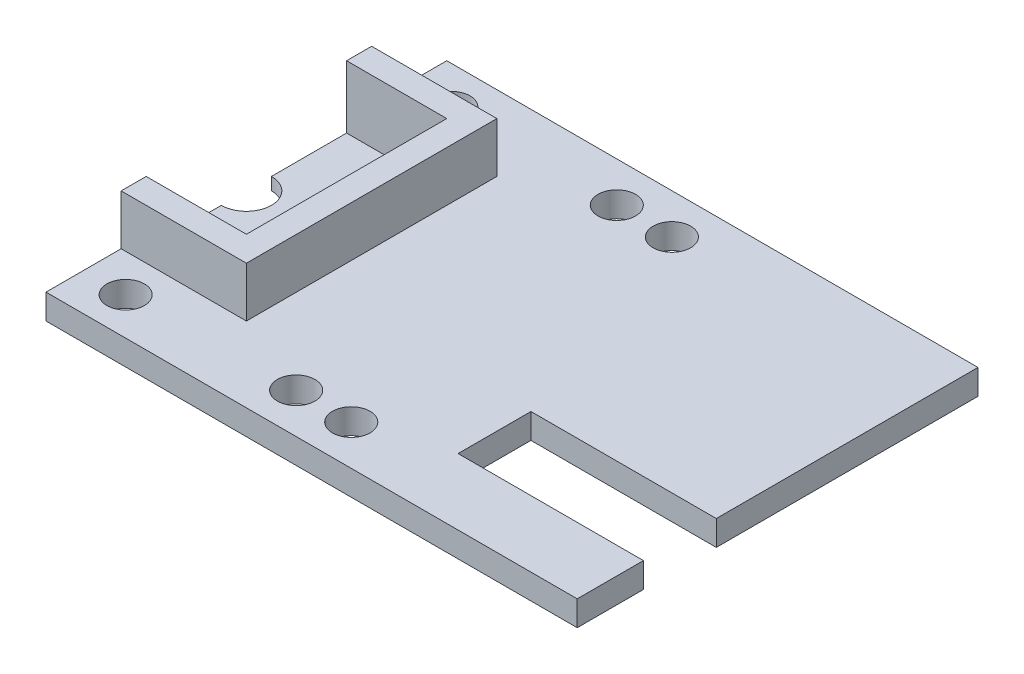
ISO-10303-21;
HEADER;
FILE_DESCRIPTION(('STEP AP214'),'2;1');
FILE_NAME('part.step','',(''),(''),'','','');
FILE_SCHEMA(('AUTOMOTIVE_DESIGN { 1 0 10303 214 1 1 1 1 }'));
ENDSEC;
DATA;
#1=APPLICATION_CONTEXT('core data for automotive mechanical design processes');
#2=APPLICATION_PROTOCOL_DEFINITION('international standard','automotive_design',2000,#1);
#3=PRODUCT_CONTEXT('',#1,'mechanical');
#4=PRODUCT('Part','Part','',(#3));
#5=PRODUCT_RELATED_PRODUCT_CATEGORY('part','',(#4));
#6=PRODUCT_DEFINITION_FORMATION('','',#4);
#7=PRODUCT_DEFINITION_CONTEXT('part definition',#1,'design');
#8=PRODUCT_DEFINITION('design','',#6,#7);
#9=PRODUCT_DEFINITION_SHAPE('','',#8);
#10=(LENGTH_UNIT() NAMED_UNIT(*) SI_UNIT(.MILLI.,.METRE.));
#11=(NAMED_UNIT(*) PLANE_ANGLE_UNIT() SI_UNIT($,.RADIAN.));
#12=(NAMED_UNIT(*) SI_UNIT($,.STERADIAN.) SOLID_ANGLE_UNIT());
#13=UNCERTAINTY_MEASURE_WITH_UNIT(LENGTH_MEASURE(1.E-05),#10,'distance_accuracy_value','');
#14=(GEOMETRIC_REPRESENTATION_CONTEXT(3) GLOBAL_UNCERTAINTY_ASSIGNED_CONTEXT((#13)) GLOBAL_UNIT_ASSIGNED_CONTEXT((#10,
#11,#12)) REPRESENTATION_CONTEXT('',''));
#15=CARTESIAN_POINT('',(0.,0.,0.));
#16=DIRECTION('',(0.,0.,1.));
#17=DIRECTION('',(1.,0.,0.));
#18=AXIS2_PLACEMENT_3D('',#15,#16,#17);
#19=CARTESIAN_POINT('',(-134.66620377136,386.673855357242,0.));
#20=DIRECTION('',(1.,0.,0.));
#21=DIRECTION('',(0.,0.,-1.));
#22=AXIS2_PLACEMENT_3D('',#19,#20,#21);
#23=PLANE('',#22);
#24=DIRECTION('',(0.,-1.,0.));
#25=VECTOR('',#24,1.);
#26=CARTESIAN_POINT('',(-134.66620377136,386.673855357242,-50.8));
#27=LINE('',#26,#25);
#28=CARTESIAN_POINT('',(-134.66620377136,6.35000000000013,-50.8));
#29=VERTEX_POINT('',#28);
#30=CARTESIAN_POINT('',(-134.66620377136,1.11022302462516E-13,-50.8));
#31=VERTEX_POINT('',#30);
#32=EDGE_CURVE('E171',#29,#31,#27,.T.);
#33=ORIENTED_EDGE('',*,*,#32,.T.);
#34=DIRECTION('',(0.,0.,1.));
#35=VECTOR('',#34,1.);
#36=CARTESIAN_POINT('',(-134.66620377136,0.,0.));
#37=LINE('',#36,#35);
#38=CARTESIAN_POINT('',(-134.66620377136,0.,-6.34999999999999));
#39=VERTEX_POINT('',#38);
#40=EDGE_CURVE('E290',#31,#39,#37,.T.);
#41=ORIENTED_EDGE('',*,*,#40,.T.);
#42=DIRECTION('',(0.,1.,0.));
#43=VECTOR('',#42,1.);
#44=CARTESIAN_POINT('',(-134.66620377136,0.,-6.34999999999999));
#45=LINE('',#44,#43);
#46=CARTESIAN_POINT('',(-134.66620377136,3.175,-6.35));
#47=VERTEX_POINT('',#46);
#48=EDGE_CURVE('E293',#47,#39,#45,.F.);
#49=ORIENTED_EDGE('',*,*,#48,.F.);
#50=DIRECTION('',(0.,0.,-1.));
#51=VECTOR('',#50,1.);
#52=CARTESIAN_POINT('',(-134.66620377136,3.175,0.));
#53=LINE('',#52,#51);
#54=CARTESIAN_POINT('',(-134.66620377136,3.175,-25.4));
#55=VERTEX_POINT('',#54);
#56=EDGE_CURVE('E54',#47,#55,#53,.T.);
#57=ORIENTED_EDGE('',*,*,#56,.T.);
#58=DIRECTION('',(0.,-1.,0.));
#59=VECTOR('',#58,1.);
#60=CARTESIAN_POINT('',(-134.66620377136,3.175,-25.4));
#61=LINE('',#60,#59);
#62=CARTESIAN_POINT('',(-134.66620377136,19.05,-25.4));
#63=VERTEX_POINT('',#62);
#64=EDGE_CURVE('E11',#63,#55,#61,.T.);
#65=ORIENTED_EDGE('',*,*,#64,.F.);
#66=DIRECTION('',(0.,0.,-1.));
#67=VECTOR('',#66,1.);
#68=CARTESIAN_POINT('',(-134.66620377136,19.05,0.));
#69=LINE('',#68,#67);
#70=CARTESIAN_POINT('',(-134.66620377136,19.05,-31.75));
#71=VERTEX_POINT('',#70);
#72=EDGE_CURVE('E351',#63,#71,#69,.T.);
#73=ORIENTED_EDGE('',*,*,#72,.T.);
#74=DIRECTION('',(0.,1.,0.));
#75=VECTOR('',#74,1.);
#76=CARTESIAN_POINT('',(-134.66620377136,19.05,-31.75));
#77=LINE('',#76,#75);
#78=CARTESIAN_POINT('',(-134.66620377136,6.35,-31.75));
#79=VERTEX_POINT('',#78);
#80=EDGE_CURVE('E354',#79,#71,#77,.T.);
#81=ORIENTED_EDGE('',*,*,#80,.F.);
#82=DIRECTION('',(0.,0.,1.));
#83=VECTOR('',#82,1.);
#84=CARTESIAN_POINT('',(-134.66620377136,6.35,0.));
#85=LINE('',#84,#83);
#86=EDGE_CURVE('E297',#29,#79,#85,.T.);
#87=ORIENTED_EDGE('',*,*,#86,.F.);
#88=EDGE_LOOP('',(#33,#41,#49,#57,#65,#73,#81,#87));
#89=FACE_BOUND('',#88,.T.);
#90=ADVANCED_FACE('F39',(#89),#23,.F.);
#91=CARTESIAN_POINT('',(0.,6.35,50.8));
#92=DIRECTION('',(-1.,0.,0.));
#93=DIRECTION('',(0.,0.,1.));
#94=AXIS2_PLACEMENT_3D('',#91,#92,#93);
#95=PLANE('',#94);
#96=DIRECTION('',(0.,0.,-1.));
#97=VECTOR('',#96,1.);
#98=CARTESIAN_POINT('',(0.,0.,50.8));
#99=LINE('',#98,#97);
#100=CARTESIAN_POINT('',(0.,0.,50.8));
#101=VERTEX_POINT('',#100);
#102=CARTESIAN_POINT('',(0.,0.,34.0128352));
#103=VERTEX_POINT('',#102);
#104=EDGE_CURVE('E198',#101,#103,#99,.T.);
#105=ORIENTED_EDGE('',*,*,#104,.T.);
#106=DIRECTION('',(0.,1.,0.));
#107=VECTOR('',#106,1.);
#108=CARTESIAN_POINT('',(0.,0.,34.0128352));
#109=LINE('',#108,#107);
#110=CARTESIAN_POINT('',(0.,6.35,34.0128352));
#111=VERTEX_POINT('',#110);
#112=EDGE_CURVE('E313',#103,#111,#109,.T.);
#113=ORIENTED_EDGE('',*,*,#112,.T.);
#114=DIRECTION('',(0.,0.,-1.));
#115=VECTOR('',#114,1.);
#116=CARTESIAN_POINT('',(0.,6.35,50.8));
#117=LINE('',#116,#115);
#118=CARTESIAN_POINT('',(0.,6.35,50.8));
#119=VERTEX_POINT('',#118);
#120=EDGE_CURVE('E194',#119,#111,#117,.T.);
#121=ORIENTED_EDGE('',*,*,#120,.F.);
#122=DIRECTION('',(0.,-1.,0.));
#123=VECTOR('',#122,1.);
#124=CARTESIAN_POINT('',(0.,6.35,50.8));
#125=LINE('',#124,#123);
#126=EDGE_CURVE('E188',#119,#101,#125,.T.);
#127=ORIENTED_EDGE('',*,*,#126,.T.);
#128=EDGE_LOOP('',(#105,#113,#121,#127));
#129=FACE_BOUND('',#128,.T.);
#130=ADVANCED_FACE('F434',(#129),#95,.F.);
#131=CARTESIAN_POINT('',(-134.66620377136,0.,0.));
#132=DIRECTION('',(0.,1.,0.));
#133=DIRECTION('',(0.,0.,1.));
#134=AXIS2_PLACEMENT_3D('',#131,#132,#133);
#135=CYLINDRICAL_SURFACE('',#134,6.35);
#136=CARTESIAN_POINT('',(-134.66620377136,3.175,0.));
#137=DIRECTION('',(0.,1.,0.));
#138=DIRECTION('',(0.,0.,1.));
#139=AXIS2_PLACEMENT_3D('',#136,#137,#138);
#140=CIRCLE('',#139,6.35);
#141=CARTESIAN_POINT('',(-134.66620377136,3.175,6.35));
#142=VERTEX_POINT('',#141);
#143=EDGE_CURVE('E210',#47,#142,#140,.F.);
#144=ORIENTED_EDGE('',*,*,#143,.F.);
#145=ORIENTED_EDGE('',*,*,#48,.T.);
#146=CARTESIAN_POINT('',(-134.66620377136,0.,0.));
#147=DIRECTION('',(0.,1.,0.));
#148=DIRECTION('',(0.,0.,1.));
#149=AXIS2_PLACEMENT_3D('',#146,#147,#148);
#150=CIRCLE('',#149,6.35);
#151=CARTESIAN_POINT('',(-134.66620377136,0.,6.34999999999999));
#152=VERTEX_POINT('',#151);
#153=EDGE_CURVE('E266',#152,#39,#150,.T.);
#154=ORIENTED_EDGE('',*,*,#153,.F.);
#155=DIRECTION('',(0.,1.,0.));
#156=VECTOR('',#155,1.);
#157=CARTESIAN_POINT('',(-134.66620377136,0.,6.34999999999999));
#158=LINE('',#157,#156);
#159=EDGE_CURVE('E183',#152,#142,#158,.T.);
#160=ORIENTED_EDGE('',*,*,#159,.T.);
#161=EDGE_LOOP('',(#144,#145,#154,#160));
#162=FACE_BOUND('',#161,.T.);
#163=ADVANCED_FACE('F375',(#162),#135,.F.);
#164=CARTESIAN_POINT('',(0.,6.35,0.));
#165=DIRECTION('',(0.,-1.,0.));
#166=DIRECTION('',(0.,0.,-1.));
#167=AXIS2_PLACEMENT_3D('',#164,#165,#166);
#168=PLANE('',#167);
#169=CARTESIAN_POINT('',(-123.99820377136,6.35,41.275));
#170=DIRECTION('',(0.,-1.,0.));
#171=DIRECTION('',(0.,0.,-1.));
#172=AXIS2_PLACEMENT_3D('',#169,#170,#171);
#173=CIRCLE('',#172,4.7625);
#174=CARTESIAN_POINT('',(-123.99820377136,6.35,36.5125));
#175=VERTEX_POINT('',#174);
#176=EDGE_CURVE('E384',#175,#175,#173,.T.);
#177=ORIENTED_EDGE('',*,*,#176,.T.);
#178=EDGE_LOOP('',(#177));
#179=FACE_BOUND('',#178,.T.);
#180=CARTESIAN_POINT('',(-123.99820377136,6.35,-41.275));
#181=DIRECTION('',(0.,1.,0.));
#182=DIRECTION('',(0.,0.,1.));
#183=AXIS2_PLACEMENT_3D('',#180,#181,#182);
#184=CIRCLE('',#183,4.7625);
#185=CARTESIAN_POINT('',(-123.99820377136,6.35,-36.5125));
#186=VERTEX_POINT('',#185);
#187=EDGE_CURVE('E378',#186,#186,#184,.T.);
#188=ORIENTED_EDGE('',*,*,#187,.F.);
#189=EDGE_LOOP('',(#188));
#190=FACE_BOUND('',#189,.T.);
#191=CARTESIAN_POINT('',(-81.4119589800342,6.35,40.64));
#192=DIRECTION('',(0.,1.,0.));
#193=DIRECTION('',(0.,0.,1.));
#194=AXIS2_PLACEMENT_3D('',#191,#192,#193);
#195=CIRCLE('',#194,4.7625);
#196=CARTESIAN_POINT('',(-81.4119589800342,6.35,45.4025));
#197=VERTEX_POINT('',#196);
#198=EDGE_CURVE('E331',#197,#197,#195,.T.);
#199=ORIENTED_EDGE('',*,*,#198,.F.);
#200=EDGE_LOOP('',(#199));
#201=FACE_BOUND('',#200,.T.);
#202=CARTESIAN_POINT('',(-67.4419589800342,6.35,-40.64));
#203=DIRECTION('',(0.,1.,0.));
#204=DIRECTION('',(0.,0.,1.));
#205=AXIS2_PLACEMENT_3D('',#202,#203,#204);
#206=CIRCLE('',#205,4.7625);
#207=CARTESIAN_POINT('',(-67.4419589800342,6.35,-35.8775));
#208=VERTEX_POINT('',#207);
#209=EDGE_CURVE('E325',#208,#208,#206,.T.);
#210=ORIENTED_EDGE('',*,*,#209,.F.);
#211=EDGE_LOOP('',(#210));
#212=FACE_BOUND('',#211,.T.);
#213=CARTESIAN_POINT('',(-81.4119589800342,6.35,-40.64));
#214=DIRECTION('',(0.,1.,0.));
#215=DIRECTION('',(0.,0.,1.));
#216=AXIS2_PLACEMENT_3D('',#213,#214,#215);
#217=CIRCLE('',#216,4.7625);
#218=CARTESIAN_POINT('',(-81.4119589800342,6.35,-35.8775));
#219=VERTEX_POINT('',#218);
#220=EDGE_CURVE('E316',#219,#219,#217,.T.);
#221=ORIENTED_EDGE('',*,*,#220,.F.);
#222=EDGE_LOOP('',(#221));
#223=FACE_BOUND('',#222,.T.);
#224=CARTESIAN_POINT('',(-67.4419589800342,6.35,40.64));
#225=DIRECTION('',(0.,1.,0.));
#226=DIRECTION('',(0.,0.,1.));
#227=AXIS2_PLACEMENT_3D('',#224,#225,#226);
#228=CIRCLE('',#227,4.7625);
#229=CARTESIAN_POINT('',(-67.4419589800342,6.35,45.4025));
#230=VERTEX_POINT('',#229);
#231=EDGE_CURVE('E235',#230,#230,#228,.T.);
#232=ORIENTED_EDGE('',*,*,#231,.F.);
#233=EDGE_LOOP('',(#232));
#234=FACE_BOUND('',#233,.T.);
#235=DIRECTION('',(-1.,0.,0.));
#236=VECTOR('',#235,1.);
#237=CARTESIAN_POINT('',(-279.4,6.35,-50.8));
#238=LINE('',#237,#236);
#239=CARTESIAN_POINT('',(0.,6.35,-50.8));
#240=VERTEX_POINT('',#239);
#241=EDGE_CURVE('E190',#240,#29,#238,.T.);
#242=ORIENTED_EDGE('',*,*,#241,.T.);
#243=ORIENTED_EDGE('',*,*,#86,.T.);
#244=DIRECTION('',(-1.,0.,0.));
#245=VECTOR('',#244,1.);
#246=CARTESIAN_POINT('',(-102.91620377136,6.35,-31.75));
#247=LINE('',#246,#245);
#248=CARTESIAN_POINT('',(-102.91620377136,6.35,-31.75));
#249=VERTEX_POINT('',#248);
#250=EDGE_CURVE('E249',#249,#79,#247,.T.);
#251=ORIENTED_EDGE('',*,*,#250,.F.);
#252=DIRECTION('',(0.,0.,-1.));
#253=VECTOR('',#252,1.);
#254=CARTESIAN_POINT('',(-102.91620377136,6.35,31.75));
#255=LINE('',#254,#253);
#256=CARTESIAN_POINT('',(-102.91620377136,6.35,31.75));
#257=VERTEX_POINT('',#256);
#258=EDGE_CURVE('E256',#257,#249,#255,.T.);
#259=ORIENTED_EDGE('',*,*,#258,.F.);
#260=DIRECTION('',(1.,0.,0.));
#261=VECTOR('',#260,1.);
#262=CARTESIAN_POINT('',(-102.91620377136,6.35,31.75));
#263=LINE('',#262,#261);
#264=CARTESIAN_POINT('',(-134.66620377136,6.35,31.75));
#265=VERTEX_POINT('',#264);
#266=EDGE_CURVE('E182',#265,#257,#263,.T.);
#267=ORIENTED_EDGE('',*,*,#266,.F.);
#268=DIRECTION('',(0.,0.,1.));
#269=VECTOR('',#268,1.);
#270=CARTESIAN_POINT('',(-134.66620377136,6.35,0.));
#271=LINE('',#270,#269);
#272=CARTESIAN_POINT('',(-134.66620377136,6.35000000000013,50.8));
#273=VERTEX_POINT('',#272);
#274=EDGE_CURVE('E164',#265,#273,#271,.T.);
#275=ORIENTED_EDGE('',*,*,#274,.T.);
#276=DIRECTION('',(1.,0.,0.));
#277=VECTOR('',#276,1.);
#278=CARTESIAN_POINT('',(-279.4,6.35,50.8));
#279=LINE('',#278,#277);
#280=EDGE_CURVE('E179',#273,#119,#279,.T.);
#281=ORIENTED_EDGE('',*,*,#280,.T.);
#282=ORIENTED_EDGE('',*,*,#120,.T.);
#283=DIRECTION('',(1.,0.,0.));
#284=VECTOR('',#283,1.);
#285=CARTESIAN_POINT('',(0.,6.35,34.0128352));
#286=LINE('',#285,#284);
#287=CARTESIAN_POINT('',(-46.9900000000001,6.35,34.0128352));
#288=VERTEX_POINT('',#287);
#289=EDGE_CURVE('E304',#288,#111,#286,.T.);
#290=ORIENTED_EDGE('',*,*,#289,.F.);
#291=DIRECTION('',(0.,0.,1.));
#292=VECTOR('',#291,1.);
#293=CARTESIAN_POINT('',(-46.9900000000001,6.35,34.0128352));
#294=LINE('',#293,#292);
#295=CARTESIAN_POINT('',(-46.9900000000001,6.35,15.542584104));
#296=VERTEX_POINT('',#295);
#297=EDGE_CURVE('E295',#296,#288,#294,.T.);
#298=ORIENTED_EDGE('',*,*,#297,.F.);
#299=DIRECTION('',(-1.,0.,0.));
#300=VECTOR('',#299,1.);
#301=CARTESIAN_POINT('',(0.,6.35,15.542584104));
#302=LINE('',#301,#300);
#303=CARTESIAN_POINT('',(0.,6.35,15.542584104));
#304=VERTEX_POINT('',#303);
#305=EDGE_CURVE('E275',#304,#296,#302,.T.);
#306=ORIENTED_EDGE('',*,*,#305,.F.);
#307=EDGE_CURVE('E206',#304,#240,#117,.T.);
#308=ORIENTED_EDGE('',*,*,#307,.T.);
#309=EDGE_LOOP('',(#242,#243,#251,#259,#267,#275,#281,#282,#290,#298,#306,#308));
#310=FACE_BOUND('',#309,.T.);
#311=ADVANCED_FACE('F177',(#179,#190,#201,#212,#223,#234,#310),#168,.F.);
#312=ORIENTED_EDGE('',*,*,#307,.F.);
#313=DIRECTION('',(0.,1.,0.));
#314=VECTOR('',#313,1.);
#315=CARTESIAN_POINT('',(0.,0.,15.542584104));
#316=LINE('',#315,#314);
#317=CARTESIAN_POINT('',(0.,0.,15.542584104));
#318=VERTEX_POINT('',#317);
#319=EDGE_CURVE('E284',#318,#304,#316,.T.);
#320=ORIENTED_EDGE('',*,*,#319,.F.);
#321=CARTESIAN_POINT('',(0.,0.,-50.8));
#322=VERTEX_POINT('',#321);
#323=EDGE_CURVE('E202',#318,#322,#99,.T.);
#324=ORIENTED_EDGE('',*,*,#323,.T.);
#325=DIRECTION('',(0.,-1.,0.));
#326=VECTOR('',#325,1.);
#327=CARTESIAN_POINT('',(0.,6.35,-50.8));
#328=LINE('',#327,#326);
#329=EDGE_CURVE('E192',#240,#322,#328,.T.);
#330=ORIENTED_EDGE('',*,*,#329,.F.);
#331=EDGE_LOOP('',(#312,#320,#324,#330));
#332=FACE_BOUND('',#331,.T.);
#333=ADVANCED_FACE('F41',(#332),#95,.F.);
#334=CARTESIAN_POINT('',(-279.4,6.35,-50.8));
#335=DIRECTION('',(0.,0.,1.));
#336=DIRECTION('',(1.,0.,0.));
#337=AXIS2_PLACEMENT_3D('',#334,#335,#336);
#338=PLANE('',#337);
#339=DIRECTION('',(-1.,0.,0.));
#340=VECTOR('',#339,1.);
#341=CARTESIAN_POINT('',(-279.4,0.,-50.8));
#342=LINE('',#341,#340);
#343=EDGE_CURVE('E201',#322,#31,#342,.T.);
#344=ORIENTED_EDGE('',*,*,#343,.T.);
#345=ORIENTED_EDGE('',*,*,#32,.F.);
#346=ORIENTED_EDGE('',*,*,#241,.F.);
#347=ORIENTED_EDGE('',*,*,#329,.T.);
#348=EDGE_LOOP('',(#344,#345,#346,#347));
#349=FACE_BOUND('',#348,.T.);
#350=ADVANCED_FACE('F281',(#349),#338,.F.);
#351=CARTESIAN_POINT('',(-279.4,6.35,50.8));
#352=DIRECTION('',(0.,0.,-1.));
#353=DIRECTION('',(-1.,0.,0.));
#354=AXIS2_PLACEMENT_3D('',#351,#352,#353);
#355=PLANE('',#354);
#356=ORIENTED_EDGE('',*,*,#280,.F.);
#357=DIRECTION('',(0.,-1.,0.));
#358=VECTOR('',#357,1.);
#359=CARTESIAN_POINT('',(-134.66620377136,386.673855357242,50.8));
#360=LINE('',#359,#358);
#361=CARTESIAN_POINT('',(-134.66620377136,1.11022302462516E-13,50.8));
#362=VERTEX_POINT('',#361);
#363=EDGE_CURVE('E161',#273,#362,#360,.T.);
#364=ORIENTED_EDGE('',*,*,#363,.T.);
#365=DIRECTION('',(1.,0.,0.));
#366=VECTOR('',#365,1.);
#367=CARTESIAN_POINT('',(-279.4,0.,50.8));
#368=LINE('',#367,#366);
#369=EDGE_CURVE('E205',#362,#101,#368,.T.);
#370=ORIENTED_EDGE('',*,*,#369,.T.);
#371=ORIENTED_EDGE('',*,*,#126,.F.);
#372=EDGE_LOOP('',(#356,#364,#370,#371));
#373=FACE_BOUND('',#372,.T.);
#374=ADVANCED_FACE('F186',(#373),#355,.F.);
#375=CARTESIAN_POINT('',(0.,0.,0.));
#376=DIRECTION('',(0.,-1.,0.));
#377=DIRECTION('',(0.,0.,-1.));
#378=AXIS2_PLACEMENT_3D('',#375,#376,#377);
#379=PLANE('',#378);
#380=CARTESIAN_POINT('',(-123.99820377136,0.,41.275));
#381=DIRECTION('',(0.,-1.,0.));
#382=DIRECTION('',(0.,0.,-1.));
#383=AXIS2_PLACEMENT_3D('',#380,#381,#382);
#384=CIRCLE('',#383,4.7625);
#385=CARTESIAN_POINT('',(-123.99820377136,0.,36.5125));
#386=VERTEX_POINT('',#385);
#387=EDGE_CURVE('E381',#386,#386,#384,.T.);
#388=ORIENTED_EDGE('',*,*,#387,.F.);
#389=EDGE_LOOP('',(#388));
#390=FACE_BOUND('',#389,.T.);
#391=CARTESIAN_POINT('',(-123.99820377136,0.,-41.275));
#392=DIRECTION('',(0.,1.,0.));
#393=DIRECTION('',(0.,0.,1.));
#394=AXIS2_PLACEMENT_3D('',#391,#392,#393);
#395=CIRCLE('',#394,4.7625);
#396=CARTESIAN_POINT('',(-123.99820377136,0.,-36.5125));
#397=VERTEX_POINT('',#396);
#398=EDGE_CURVE('E172',#397,#397,#395,.T.);
#399=ORIENTED_EDGE('',*,*,#398,.T.);
#400=EDGE_LOOP('',(#399));
#401=FACE_BOUND('',#400,.T.);
#402=ORIENTED_EDGE('',*,*,#40,.F.);
#403=ORIENTED_EDGE('',*,*,#343,.F.);
#404=ORIENTED_EDGE('',*,*,#323,.F.);
#405=DIRECTION('',(-1.,0.,0.));
#406=VECTOR('',#405,1.);
#407=CARTESIAN_POINT('',(0.,0.,15.542584104));
#408=LINE('',#407,#406);
#409=CARTESIAN_POINT('',(-46.9900000000001,0.,15.542584104));
#410=VERTEX_POINT('',#409);
#411=EDGE_CURVE('E301',#318,#410,#408,.T.);
#412=ORIENTED_EDGE('',*,*,#411,.T.);
#413=DIRECTION('',(0.,0.,1.));
#414=VECTOR('',#413,1.);
#415=CARTESIAN_POINT('',(-46.9900000000001,0.,34.0128352));
#416=LINE('',#415,#414);
#417=CARTESIAN_POINT('',(-46.9900000000001,0.,34.0128352));
#418=VERTEX_POINT('',#417);
#419=EDGE_CURVE('E303',#410,#418,#416,.T.);
#420=ORIENTED_EDGE('',*,*,#419,.T.);
#421=DIRECTION('',(1.,0.,0.));
#422=VECTOR('',#421,1.);
#423=CARTESIAN_POINT('',(0.,0.,34.0128352));
#424=LINE('',#423,#422);
#425=EDGE_CURVE('E307',#418,#103,#424,.T.);
#426=ORIENTED_EDGE('',*,*,#425,.T.);
#427=ORIENTED_EDGE('',*,*,#104,.F.);
#428=ORIENTED_EDGE('',*,*,#369,.F.);
#429=DIRECTION('',(0.,0.,1.));
#430=VECTOR('',#429,1.);
#431=CARTESIAN_POINT('',(-134.66620377136,0.,0.));
#432=LINE('',#431,#430);
#433=EDGE_CURVE('E167',#152,#362,#432,.T.);
#434=ORIENTED_EDGE('',*,*,#433,.F.);
#435=ORIENTED_EDGE('',*,*,#153,.T.);
#436=EDGE_LOOP('',(#402,#403,#404,#412,#420,#426,#427,#428,#434,#435));
#437=FACE_BOUND('',#436,.T.);
#438=CARTESIAN_POINT('',(-81.4119589800342,0.,40.64));
#439=DIRECTION('',(0.,1.,0.));
#440=DIRECTION('',(0.,0.,1.));
#441=AXIS2_PLACEMENT_3D('',#438,#439,#440);
#442=CIRCLE('',#441,4.7625);
#443=CARTESIAN_POINT('',(-81.4119589800342,0.,45.4025));
#444=VERTEX_POINT('',#443);
#445=EDGE_CURVE('E328',#444,#444,#442,.T.);
#446=ORIENTED_EDGE('',*,*,#445,.T.);
#447=EDGE_LOOP('',(#446));
#448=FACE_BOUND('',#447,.T.);
#449=CARTESIAN_POINT('',(-67.4419589800342,0.,-40.64));
#450=DIRECTION('',(0.,1.,0.));
#451=DIRECTION('',(0.,0.,1.));
#452=AXIS2_PLACEMENT_3D('',#449,#450,#451);
#453=CIRCLE('',#452,4.7625);
#454=CARTESIAN_POINT('',(-67.4419589800342,0.,-35.8775));
#455=VERTEX_POINT('',#454);
#456=EDGE_CURVE('E334',#455,#455,#453,.T.);
#457=ORIENTED_EDGE('',*,*,#456,.T.);
#458=EDGE_LOOP('',(#457));
#459=FACE_BOUND('',#458,.T.);
#460=CARTESIAN_POINT('',(-81.4119589800342,0.,-40.64));
#461=DIRECTION('',(0.,1.,0.));
#462=DIRECTION('',(0.,0.,1.));
#463=AXIS2_PLACEMENT_3D('',#460,#461,#462);
#464=CIRCLE('',#463,4.7625);
#465=CARTESIAN_POINT('',(-81.4119589800342,0.,-35.8775));
#466=VERTEX_POINT('',#465);
#467=EDGE_CURVE('E322',#466,#466,#464,.T.);
#468=ORIENTED_EDGE('',*,*,#467,.T.);
#469=EDGE_LOOP('',(#468));
#470=FACE_BOUND('',#469,.T.);
#471=CARTESIAN_POINT('',(-67.4419589800342,0.,40.64));
#472=DIRECTION('',(0.,1.,0.));
#473=DIRECTION('',(0.,0.,1.));
#474=AXIS2_PLACEMENT_3D('',#471,#472,#473);
#475=CIRCLE('',#474,4.7625);
#476=CARTESIAN_POINT('',(-67.4419589800342,0.,45.4025));
#477=VERTEX_POINT('',#476);
#478=EDGE_CURVE('E230',#477,#477,#475,.T.);
#479=ORIENTED_EDGE('',*,*,#478,.T.);
#480=EDGE_LOOP('',(#479));
#481=FACE_BOUND('',#480,.T.);
#482=ADVANCED_FACE('F288',(#390,#401,#437,#448,#459,#470,#481),#379,.T.);
#483=CARTESIAN_POINT('',(-102.91620377136,19.05,31.75));
#484=DIRECTION('',(0.,0.,-1.));
#485=DIRECTION('',(-1.,0.,0.));
#486=AXIS2_PLACEMENT_3D('',#483,#484,#485);
#487=PLANE('',#486);
#488=DIRECTION('',(1.,0.,0.));
#489=VECTOR('',#488,1.);
#490=CARTESIAN_POINT('',(-102.91620377136,19.05,31.75));
#491=LINE('',#490,#489);
#492=CARTESIAN_POINT('',(-134.66620377136,19.05,31.75));
#493=VERTEX_POINT('',#492);
#494=CARTESIAN_POINT('',(-102.91620377136,19.05,31.75));
#495=VERTEX_POINT('',#494);
#496=EDGE_CURVE('E246',#493,#495,#491,.T.);
#497=ORIENTED_EDGE('',*,*,#496,.F.);
#498=DIRECTION('',(0.,-1.,0.));
#499=VECTOR('',#498,1.);
#500=CARTESIAN_POINT('',(-134.66620377136,19.05,31.75));
#501=LINE('',#500,#499);
#502=EDGE_CURVE('E184',#493,#265,#501,.T.);
#503=ORIENTED_EDGE('',*,*,#502,.T.);
#504=ORIENTED_EDGE('',*,*,#266,.T.);
#505=DIRECTION('',(0.,-1.,0.));
#506=VECTOR('',#505,1.);
#507=CARTESIAN_POINT('',(-102.91620377136,19.05,31.75));
#508=LINE('',#507,#506);
#509=EDGE_CURVE('E263',#495,#257,#508,.T.);
#510=ORIENTED_EDGE('',*,*,#509,.F.);
#511=EDGE_LOOP('',(#497,#503,#504,#510));
#512=FACE_BOUND('',#511,.T.);
#513=ADVANCED_FACE('F367',(#512),#487,.F.);
#514=CARTESIAN_POINT('',(-102.91620377136,19.05,31.75));
#515=DIRECTION('',(-1.,0.,0.));
#516=DIRECTION('',(0.,0.,1.));
#517=AXIS2_PLACEMENT_3D('',#514,#515,#516);
#518=PLANE('',#517);
#519=ORIENTED_EDGE('',*,*,#258,.T.);
#520=DIRECTION('',(0.,-1.,0.));
#521=VECTOR('',#520,1.);
#522=CARTESIAN_POINT('',(-102.91620377136,19.05,-31.75));
#523=LINE('',#522,#521);
#524=CARTESIAN_POINT('',(-102.91620377136,19.05,-31.75));
#525=VERTEX_POINT('',#524);
#526=EDGE_CURVE('E254',#525,#249,#523,.T.);
#527=ORIENTED_EDGE('',*,*,#526,.F.);
#528=DIRECTION('',(0.,0.,-1.));
#529=VECTOR('',#528,1.);
#530=CARTESIAN_POINT('',(-102.91620377136,19.05,31.75));
#531=LINE('',#530,#529);
#532=EDGE_CURVE('E248',#495,#525,#531,.T.);
#533=ORIENTED_EDGE('',*,*,#532,.F.);
#534=ORIENTED_EDGE('',*,*,#509,.T.);
#535=EDGE_LOOP('',(#519,#527,#533,#534));
#536=FACE_BOUND('',#535,.T.);
#537=ADVANCED_FACE('F364',(#536),#518,.F.);
#538=CARTESIAN_POINT('',(-102.91620377136,19.05,-31.75));
#539=DIRECTION('',(0.,0.,1.));
#540=DIRECTION('',(1.,0.,0.));
#541=AXIS2_PLACEMENT_3D('',#538,#539,#540);
#542=PLANE('',#541);
#543=ORIENTED_EDGE('',*,*,#250,.T.);
#544=ORIENTED_EDGE('',*,*,#80,.T.);
#545=DIRECTION('',(-1.,0.,0.));
#546=VECTOR('',#545,1.);
#547=CARTESIAN_POINT('',(-102.91620377136,19.05,-31.75));
#548=LINE('',#547,#546);
#549=EDGE_CURVE('E251',#525,#71,#548,.T.);
#550=ORIENTED_EDGE('',*,*,#549,.F.);
#551=ORIENTED_EDGE('',*,*,#526,.T.);
#552=EDGE_LOOP('',(#543,#544,#550,#551));
#553=FACE_BOUND('',#552,.T.);
#554=ADVANCED_FACE('F360',(#553),#542,.F.);
#555=CARTESIAN_POINT('',(0.,19.05,0.));
#556=DIRECTION('',(0.,1.,0.));
#557=DIRECTION('',(0.,0.,1.));
#558=AXIS2_PLACEMENT_3D('',#555,#556,#557);
#559=PLANE('',#558);
#560=ORIENTED_EDGE('',*,*,#72,.F.);
#561=DIRECTION('',(-1.,0.,0.));
#562=VECTOR('',#561,1.);
#563=CARTESIAN_POINT('',(-109.26620377136,19.05,-25.4));
#564=LINE('',#563,#562);
#565=CARTESIAN_POINT('',(-109.26620377136,19.05,-25.4));
#566=VERTEX_POINT('',#565);
#567=EDGE_CURVE('E232',#566,#63,#564,.T.);
#568=ORIENTED_EDGE('',*,*,#567,.F.);
#569=DIRECTION('',(0.,0.,-1.));
#570=VECTOR('',#569,1.);
#571=CARTESIAN_POINT('',(-109.26620377136,19.05,25.4));
#572=LINE('',#571,#570);
#573=CARTESIAN_POINT('',(-109.26620377136,19.05,25.4));
#574=VERTEX_POINT('',#573);
#575=EDGE_CURVE('E229',#574,#566,#572,.T.);
#576=ORIENTED_EDGE('',*,*,#575,.F.);
#577=DIRECTION('',(1.,0.,0.));
#578=VECTOR('',#577,1.);
#579=CARTESIAN_POINT('',(-109.26620377136,19.05,25.4));
#580=LINE('',#579,#578);
#581=CARTESIAN_POINT('',(-134.66620377136,19.05,25.4));
#582=VERTEX_POINT('',#581);
#583=EDGE_CURVE('E218',#582,#574,#580,.T.);
#584=ORIENTED_EDGE('',*,*,#583,.F.);
#585=DIRECTION('',(0.,0.,-1.));
#586=VECTOR('',#585,1.);
#587=CARTESIAN_POINT('',(-134.66620377136,19.05,0.));
#588=LINE('',#587,#586);
#589=EDGE_CURVE('E61',#493,#582,#588,.T.);
#590=ORIENTED_EDGE('',*,*,#589,.F.);
#591=ORIENTED_EDGE('',*,*,#496,.T.);
#592=ORIENTED_EDGE('',*,*,#532,.T.);
#593=ORIENTED_EDGE('',*,*,#549,.T.);
#594=EDGE_LOOP('',(#560,#568,#576,#584,#590,#591,#592,#593));
#595=FACE_BOUND('',#594,.T.);
#596=ADVANCED_FACE('F225',(#595),#559,.T.);
#597=CARTESIAN_POINT('',(0.,3.175,0.));
#598=DIRECTION('',(0.,1.,0.));
#599=DIRECTION('',(0.,0.,1.));
#600=AXIS2_PLACEMENT_3D('',#597,#598,#599);
#601=PLANE('',#600);
#602=ORIENTED_EDGE('',*,*,#56,.F.);
#603=ORIENTED_EDGE('',*,*,#143,.T.);
#604=DIRECTION('',(0.,0.,-1.));
#605=VECTOR('',#604,1.);
#606=CARTESIAN_POINT('',(-134.66620377136,3.175,0.));
#607=LINE('',#606,#605);
#608=CARTESIAN_POINT('',(-134.66620377136,3.175,25.4));
#609=VERTEX_POINT('',#608);
#610=EDGE_CURVE('E369',#609,#142,#607,.T.);
#611=ORIENTED_EDGE('',*,*,#610,.F.);
#612=DIRECTION('',(1.,0.,0.));
#613=VECTOR('',#612,1.);
#614=CARTESIAN_POINT('',(-109.26620377136,3.175,25.4));
#615=LINE('',#614,#613);
#616=CARTESIAN_POINT('',(-109.26620377136,3.175,25.4));
#617=VERTEX_POINT('',#616);
#618=EDGE_CURVE('E220',#609,#617,#615,.T.);
#619=ORIENTED_EDGE('',*,*,#618,.T.);
#620=DIRECTION('',(0.,0.,-1.));
#621=VECTOR('',#620,1.);
#622=CARTESIAN_POINT('',(-109.26620377136,3.175,25.4));
#623=LINE('',#622,#621);
#624=CARTESIAN_POINT('',(-109.26620377136,3.175,-25.4));
#625=VERTEX_POINT('',#624);
#626=EDGE_CURVE('E341',#617,#625,#623,.T.);
#627=ORIENTED_EDGE('',*,*,#626,.T.);
#628=DIRECTION('',(-1.,0.,0.));
#629=VECTOR('',#628,1.);
#630=CARTESIAN_POINT('',(-109.26620377136,3.175,-25.4));
#631=LINE('',#630,#629);
#632=EDGE_CURVE('E238',#625,#55,#631,.T.);
#633=ORIENTED_EDGE('',*,*,#632,.T.);
#634=EDGE_LOOP('',(#602,#603,#611,#619,#627,#633));
#635=FACE_BOUND('',#634,.T.);
#636=ADVANCED_FACE('F347',(#635),#601,.T.);
#637=CARTESIAN_POINT('',(-109.26620377136,3.175,-25.4));
#638=DIRECTION('',(0.,0.,-1.));
#639=DIRECTION('',(-1.,0.,0.));
#640=AXIS2_PLACEMENT_3D('',#637,#638,#639);
#641=PLANE('',#640);
#642=ORIENTED_EDGE('',*,*,#567,.T.);
#643=ORIENTED_EDGE('',*,*,#64,.T.);
#644=ORIENTED_EDGE('',*,*,#632,.F.);
#645=DIRECTION('',(0.,1.,0.));
#646=VECTOR('',#645,1.);
#647=CARTESIAN_POINT('',(-109.26620377136,3.175,-25.4));
#648=LINE('',#647,#646);
#649=EDGE_CURVE('E212',#625,#566,#648,.T.);
#650=ORIENTED_EDGE('',*,*,#649,.T.);
#651=EDGE_LOOP('',(#642,#643,#644,#650));
#652=FACE_BOUND('',#651,.T.);
#653=ADVANCED_FACE('F350',(#652),#641,.F.);
#654=CARTESIAN_POINT('',(-109.26620377136,3.175,25.4));
#655=DIRECTION('',(1.,0.,0.));
#656=DIRECTION('',(0.,0.,-1.));
#657=AXIS2_PLACEMENT_3D('',#654,#655,#656);
#658=PLANE('',#657);
#659=ORIENTED_EDGE('',*,*,#575,.T.);
#660=ORIENTED_EDGE('',*,*,#649,.F.);
#661=ORIENTED_EDGE('',*,*,#626,.F.);
#662=DIRECTION('',(0.,1.,0.));
#663=VECTOR('',#662,1.);
#664=CARTESIAN_POINT('',(-109.26620377136,3.175,25.4));
#665=LINE('',#664,#663);
#666=EDGE_CURVE('E244',#617,#574,#665,.T.);
#667=ORIENTED_EDGE('',*,*,#666,.T.);
#668=EDGE_LOOP('',(#659,#660,#661,#667));
#669=FACE_BOUND('',#668,.T.);
#670=ADVANCED_FACE('F428',(#669),#658,.F.);
#671=CARTESIAN_POINT('',(-109.26620377136,3.175,25.4));
#672=DIRECTION('',(0.,0.,1.));
#673=DIRECTION('',(1.,0.,0.));
#674=AXIS2_PLACEMENT_3D('',#671,#672,#673);
#675=PLANE('',#674);
#676=ORIENTED_EDGE('',*,*,#618,.F.);
#677=DIRECTION('',(0.,1.,0.));
#678=VECTOR('',#677,1.);
#679=CARTESIAN_POINT('',(-134.66620377136,3.175,25.4));
#680=LINE('',#679,#678);
#681=EDGE_CURVE('E47',#609,#582,#680,.T.);
#682=ORIENTED_EDGE('',*,*,#681,.T.);
#683=ORIENTED_EDGE('',*,*,#583,.T.);
#684=ORIENTED_EDGE('',*,*,#666,.F.);
#685=EDGE_LOOP('',(#676,#682,#683,#684));
#686=FACE_BOUND('',#685,.T.);
#687=ADVANCED_FACE('F216',(#686),#675,.F.);
#688=CARTESIAN_POINT('',(-67.4419589800342,0.,40.64));
#689=DIRECTION('',(0.,1.,0.));
#690=DIRECTION('',(0.,0.,1.));
#691=AXIS2_PLACEMENT_3D('',#688,#689,#690);
#692=CYLINDRICAL_SURFACE('',#691,4.7625);
#693=ORIENTED_EDGE('',*,*,#478,.F.);
#694=EDGE_LOOP('',(#693));
#695=FACE_BOUND('',#694,.T.);
#696=ORIENTED_EDGE('',*,*,#231,.T.);
#697=EDGE_LOOP('',(#696));
#698=FACE_BOUND('',#697,.T.);
#699=ADVANCED_FACE('F416',(#695,#698),#692,.F.);
#700=CARTESIAN_POINT('',(-81.4119589800342,0.,-40.64));
#701=DIRECTION('',(0.,1.,0.));
#702=DIRECTION('',(0.,0.,1.));
#703=AXIS2_PLACEMENT_3D('',#700,#701,#702);
#704=CYLINDRICAL_SURFACE('',#703,4.7625);
#705=ORIENTED_EDGE('',*,*,#467,.F.);
#706=EDGE_LOOP('',(#705));
#707=FACE_BOUND('',#706,.T.);
#708=ORIENTED_EDGE('',*,*,#220,.T.);
#709=EDGE_LOOP('',(#708));
#710=FACE_BOUND('',#709,.T.);
#711=ADVANCED_FACE('F418',(#707,#710),#704,.F.);
#712=CARTESIAN_POINT('',(-67.4419589800342,0.,-40.64));
#713=DIRECTION('',(0.,1.,0.));
#714=DIRECTION('',(0.,0.,1.));
#715=AXIS2_PLACEMENT_3D('',#712,#713,#714);
#716=CYLINDRICAL_SURFACE('',#715,4.7625);
#717=ORIENTED_EDGE('',*,*,#456,.F.);
#718=EDGE_LOOP('',(#717));
#719=FACE_BOUND('',#718,.T.);
#720=ORIENTED_EDGE('',*,*,#209,.T.);
#721=EDGE_LOOP('',(#720));
#722=FACE_BOUND('',#721,.T.);
#723=ADVANCED_FACE('F425',(#719,#722),#716,.F.);
#724=CARTESIAN_POINT('',(-81.4119589800342,0.,40.64));
#725=DIRECTION('',(0.,1.,0.));
#726=DIRECTION('',(0.,0.,1.));
#727=AXIS2_PLACEMENT_3D('',#724,#725,#726);
#728=CYLINDRICAL_SURFACE('',#727,4.7625);
#729=ORIENTED_EDGE('',*,*,#445,.F.);
#730=EDGE_LOOP('',(#729));
#731=FACE_BOUND('',#730,.T.);
#732=ORIENTED_EDGE('',*,*,#198,.T.);
#733=EDGE_LOOP('',(#732));
#734=FACE_BOUND('',#733,.T.);
#735=ADVANCED_FACE('F446',(#731,#734),#728,.F.);
#736=CARTESIAN_POINT('',(0.,0.,34.0128352));
#737=DIRECTION('',(0.,0.,1.));
#738=DIRECTION('',(1.,0.,0.));
#739=AXIS2_PLACEMENT_3D('',#736,#737,#738);
#740=PLANE('',#739);
#741=ORIENTED_EDGE('',*,*,#289,.T.);
#742=ORIENTED_EDGE('',*,*,#112,.F.);
#743=ORIENTED_EDGE('',*,*,#425,.F.);
#744=DIRECTION('',(0.,1.,0.));
#745=VECTOR('',#744,1.);
#746=CARTESIAN_POINT('',(-46.9900000000001,0.,34.0128352));
#747=LINE('',#746,#745);
#748=EDGE_CURVE('E317',#418,#288,#747,.T.);
#749=ORIENTED_EDGE('',*,*,#748,.T.);
#750=EDGE_LOOP('',(#741,#742,#743,#749));
#751=FACE_BOUND('',#750,.T.);
#752=ADVANCED_FACE('F442',(#751),#740,.F.);
#753=CARTESIAN_POINT('',(-46.9900000000001,0.,34.0128352));
#754=DIRECTION('',(-1.,0.,0.));
#755=DIRECTION('',(0.,0.,1.));
#756=AXIS2_PLACEMENT_3D('',#753,#754,#755);
#757=PLANE('',#756);
#758=ORIENTED_EDGE('',*,*,#297,.T.);
#759=ORIENTED_EDGE('',*,*,#748,.F.);
#760=ORIENTED_EDGE('',*,*,#419,.F.);
#761=DIRECTION('',(0.,1.,0.));
#762=VECTOR('',#761,1.);
#763=CARTESIAN_POINT('',(-46.9900000000001,0.,15.542584104));
#764=LINE('',#763,#762);
#765=EDGE_CURVE('E319',#410,#296,#764,.T.);
#766=ORIENTED_EDGE('',*,*,#765,.T.);
#767=EDGE_LOOP('',(#758,#759,#760,#766));
#768=FACE_BOUND('',#767,.T.);
#769=ADVANCED_FACE('F445',(#768),#757,.F.);
#770=CARTESIAN_POINT('',(0.,0.,15.542584104));
#771=DIRECTION('',(0.,0.,-1.));
#772=DIRECTION('',(-1.,0.,0.));
#773=AXIS2_PLACEMENT_3D('',#770,#771,#772);
#774=PLANE('',#773);
#775=ORIENTED_EDGE('',*,*,#305,.T.);
#776=ORIENTED_EDGE('',*,*,#765,.F.);
#777=ORIENTED_EDGE('',*,*,#411,.F.);
#778=ORIENTED_EDGE('',*,*,#319,.T.);
#779=EDGE_LOOP('',(#775,#776,#777,#778));
#780=FACE_BOUND('',#779,.T.);
#781=ADVANCED_FACE('F450',(#780),#774,.F.);
#782=CARTESIAN_POINT('',(-134.66620377136,386.673855357242,0.));
#783=DIRECTION('',(1.,0.,0.));
#784=DIRECTION('',(0.,0.,-1.));
#785=AXIS2_PLACEMENT_3D('',#782,#783,#784);
#786=PLANE('',#785);
#787=ORIENTED_EDGE('',*,*,#159,.F.);
#788=ORIENTED_EDGE('',*,*,#433,.T.);
#789=ORIENTED_EDGE('',*,*,#363,.F.);
#790=ORIENTED_EDGE('',*,*,#274,.F.);
#791=ORIENTED_EDGE('',*,*,#502,.F.);
#792=ORIENTED_EDGE('',*,*,#589,.T.);
#793=ORIENTED_EDGE('',*,*,#681,.F.);
#794=ORIENTED_EDGE('',*,*,#610,.T.);
#795=EDGE_LOOP('',(#787,#788,#789,#790,#791,#792,#793,#794));
#796=FACE_BOUND('',#795,.T.);
#797=ADVANCED_FACE('F163',(#796),#786,.F.);
#798=CARTESIAN_POINT('',(-123.99820377136,0.,-41.275));
#799=DIRECTION('',(0.,1.,0.));
#800=DIRECTION('',(0.,0.,1.));
#801=AXIS2_PLACEMENT_3D('',#798,#799,#800);
#802=CYLINDRICAL_SURFACE('',#801,4.7625);
#803=ORIENTED_EDGE('',*,*,#398,.F.);
#804=EDGE_LOOP('',(#803));
#805=FACE_BOUND('',#804,.T.);
#806=ORIENTED_EDGE('',*,*,#187,.T.);
#807=EDGE_LOOP('',(#806));
#808=FACE_BOUND('',#807,.T.);
#809=ADVANCED_FACE('F398',(#805,#808),#802,.F.);
#810=CARTESIAN_POINT('',(-123.99820377136,0.,41.275));
#811=DIRECTION('',(0.,1.,0.));
#812=DIRECTION('',(0.,0.,1.));
#813=AXIS2_PLACEMENT_3D('',#810,#811,#812);
#814=CYLINDRICAL_SURFACE('',#813,4.7625);
#815=ORIENTED_EDGE('',*,*,#387,.T.);
#816=EDGE_LOOP('',(#815));
#817=FACE_BOUND('',#816,.T.);
#818=ORIENTED_EDGE('',*,*,#176,.F.);
#819=EDGE_LOOP('',(#818));
#820=FACE_BOUND('',#819,.T.);
#821=ADVANCED_FACE('F390',(#817,#820),#814,.F.);
#822=CLOSED_SHELL('',(#90,#130,#163,#311,#333,#350,#374,#482,#513,#537,#554,#596,#636,#653,#670,
#687,#699,#711,#723,#735,#752,#769,#781,#797,#809,#821));
#823=MANIFOLD_SOLID_BREP('B2',#822);
#824=ADVANCED_BREP_SHAPE_REPRESENTATION('',(#18,#823),#14);
#825=SHAPE_DEFINITION_REPRESENTATION(#9,#824);
ENDSEC;
END-ISO-10303-21;
